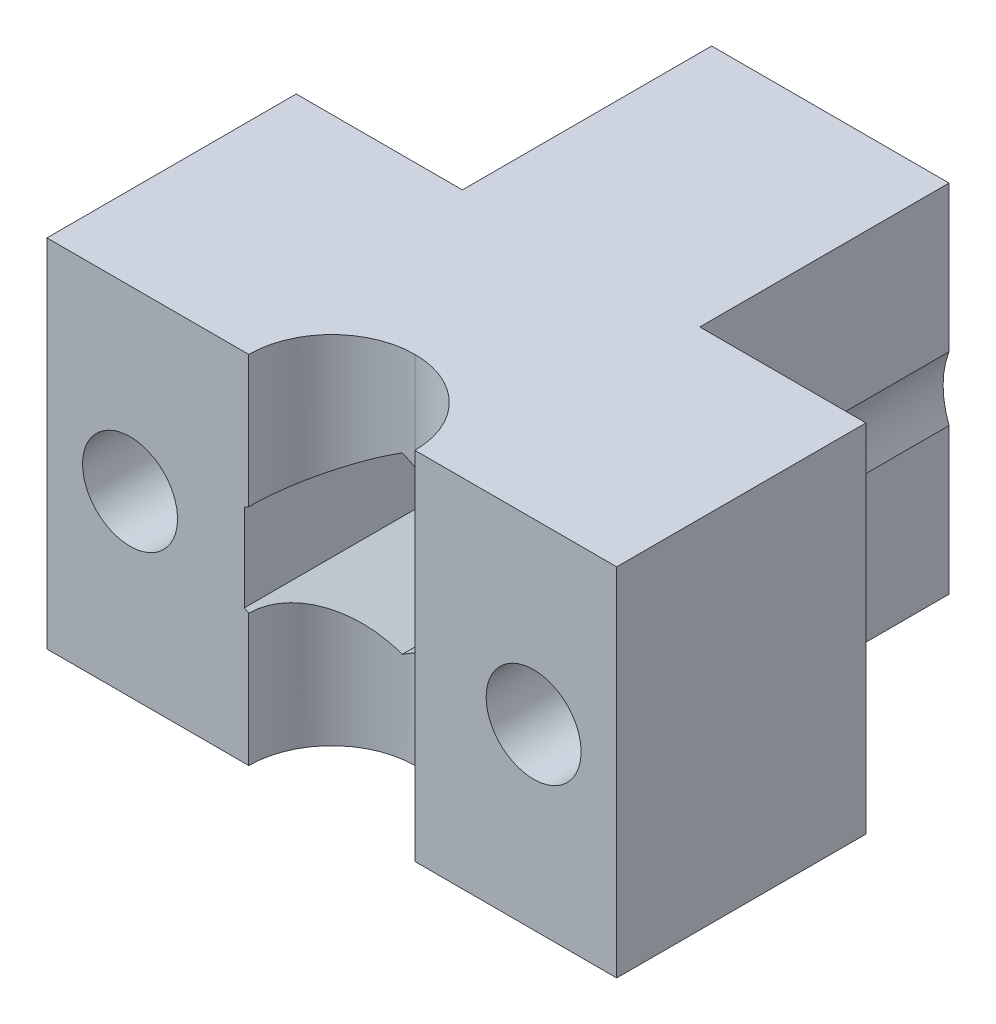
ISO-10303-21;
HEADER;
FILE_DESCRIPTION(('STEP AP214'),'2;1');
FILE_NAME('part.step','',(''),(''),'','','');
FILE_SCHEMA(('AUTOMOTIVE_DESIGN { 1 0 10303 214 1 1 1 1 }'));
ENDSEC;
DATA;
#1=APPLICATION_CONTEXT('core data for automotive mechanical design processes');
#2=APPLICATION_PROTOCOL_DEFINITION('international standard','automotive_design',2000,#1);
#3=PRODUCT_CONTEXT('',#1,'mechanical');
#4=PRODUCT('Part','Part','',(#3));
#5=PRODUCT_RELATED_PRODUCT_CATEGORY('part','',(#4));
#6=PRODUCT_DEFINITION_FORMATION('','',#4);
#7=PRODUCT_DEFINITION_CONTEXT('part definition',#1,'design');
#8=PRODUCT_DEFINITION('design','',#6,#7);
#9=PRODUCT_DEFINITION_SHAPE('','',#8);
#10=(LENGTH_UNIT() NAMED_UNIT(*) SI_UNIT(.MILLI.,.METRE.));
#11=(NAMED_UNIT(*) PLANE_ANGLE_UNIT() SI_UNIT($,.RADIAN.));
#12=(NAMED_UNIT(*) SI_UNIT($,.STERADIAN.) SOLID_ANGLE_UNIT());
#13=UNCERTAINTY_MEASURE_WITH_UNIT(LENGTH_MEASURE(1.E-05),#10,'distance_accuracy_value','');
#14=(GEOMETRIC_REPRESENTATION_CONTEXT(3) GLOBAL_UNCERTAINTY_ASSIGNED_CONTEXT((#13)) GLOBAL_UNIT_ASSIGNED_CONTEXT((#10,
#11,#12)) REPRESENTATION_CONTEXT('',''));
#15=CARTESIAN_POINT('',(0.,0.,0.));
#16=DIRECTION('',(0.,0.,1.));
#17=DIRECTION('',(1.,0.,0.));
#18=AXIS2_PLACEMENT_3D('',#15,#16,#17);
#19=CARTESIAN_POINT('',(0.,0.,10.));
#20=DIRECTION('',(0.,-1.,0.));
#21=DIRECTION('',(1.,0.,0.));
#22=AXIS2_PLACEMENT_3D('',#19,#20,#21);
#23=CYLINDRICAL_SURFACE('',#22,7.);
#24=CARTESIAN_POINT('',(0.,8.22735026918962,10.));
#25=DIRECTION('',(0.5,-0.866025403784439,0.));
#26=DIRECTION('',(-0.866025403784439,-0.5,0.));
#27=AXIS2_PLACEMENT_3D('',#24,#25,#26);
#28=ELLIPSE('',#27,8.08290376865476,7.);
#29=CARTESIAN_POINT('',(0.,8.22735026918962,3.));
#30=VERTEX_POINT('',#29);
#31=CARTESIAN_POINT('',(-1.,7.65,3.07179676972449));
#32=VERTEX_POINT('',#31);
#33=EDGE_CURVE('E456',#30,#32,#28,.F.);
#34=ORIENTED_EDGE('',*,*,#33,.T.);
#35=CARTESIAN_POINT('',(0.,7.07264973081037,10.));
#36=DIRECTION('',(-0.5,-0.866025403784439,0.));
#37=DIRECTION('',(0.866025403784439,-0.5,0.));
#38=AXIS2_PLACEMENT_3D('',#35,#36,#37);
#39=ELLIPSE('',#38,8.08290376865476,7.);
#40=CARTESIAN_POINT('',(-7.,11.1141016151378,10.));
#41=VERTEX_POINT('',#40);
#42=EDGE_CURVE('E459',#32,#41,#39,.F.);
#43=ORIENTED_EDGE('',*,*,#42,.T.);
#44=DIRECTION('',(0.,-1.,0.));
#45=VECTOR('',#44,1.);
#46=CARTESIAN_POINT('',(-7.00000000000001,30.,10.));
#47=LINE('',#46,#45);
#48=CARTESIAN_POINT('',(-7.,0.,10.));
#49=VERTEX_POINT('',#48);
#50=EDGE_CURVE('E394',#41,#49,#47,.T.);
#51=ORIENTED_EDGE('',*,*,#50,.T.);
#52=CARTESIAN_POINT('',(0.,0.,10.));
#53=DIRECTION('',(0.,-1.,0.));
#54=DIRECTION('',(0.,0.,-1.));
#55=AXIS2_PLACEMENT_3D('',#52,#53,#54);
#56=CIRCLE('',#55,7.);
#57=CARTESIAN_POINT('',(0.,0.,3.));
#58=VERTEX_POINT('',#57);
#59=EDGE_CURVE('E426',#58,#49,#56,.F.);
#60=ORIENTED_EDGE('',*,*,#59,.F.);
#61=DIRECTION('',(0.,1.,0.));
#62=VECTOR('',#61,1.);
#63=CARTESIAN_POINT('',(0.,0.,3.));
#64=LINE('',#63,#62);
#65=EDGE_CURVE('E320',#58,#30,#64,.T.);
#66=ORIENTED_EDGE('',*,*,#65,.T.);
#67=EDGE_LOOP('',(#34,#43,#51,#60,#66));
#68=FACE_BOUND('',#67,.T.);
#69=ADVANCED_FACE('F37',(#68),#23,.F.);
#70=CARTESIAN_POINT('',(-10.,0.,0.));
#71=DIRECTION('',(1.,0.,0.));
#72=DIRECTION('',(0.,0.,-1.));
#73=AXIS2_PLACEMENT_3D('',#70,#71,#72);
#74=PLANE('',#73);
#75=DIRECTION('',(0.,0.,1.));
#76=VECTOR('',#75,1.);
#77=CARTESIAN_POINT('',(-10.,17.6925824035673,-32.));
#78=LINE('',#77,#76);
#79=CARTESIAN_POINT('',(-10.,17.6925824035673,-11.));
#80=VERTEX_POINT('',#79);
#81=CARTESIAN_POINT('',(-10.,17.6925824035673,-16.3));
#82=VERTEX_POINT('',#81);
#83=EDGE_CURVE('E450',#80,#82,#78,.F.);
#84=ORIENTED_EDGE('',*,*,#83,.F.);
#85=DIRECTION('',(0.,1.,0.));
#86=VECTOR('',#85,1.);
#87=CARTESIAN_POINT('',(-10.,0.,-11.));
#88=LINE('',#87,#86);
#89=CARTESIAN_POINT('',(-10.,30.,-11.));
#90=VERTEX_POINT('',#89);
#91=EDGE_CURVE('E354',#80,#90,#88,.T.);
#92=ORIENTED_EDGE('',*,*,#91,.T.);
#93=DIRECTION('',(0.,0.,-1.));
#94=VECTOR('',#93,1.);
#95=CARTESIAN_POINT('',(-10.,30.,-11.));
#96=LINE('',#95,#94);
#97=CARTESIAN_POINT('',(-10.,30.,-32.));
#98=VERTEX_POINT('',#97);
#99=EDGE_CURVE('E358',#90,#98,#96,.T.);
#100=ORIENTED_EDGE('',*,*,#99,.T.);
#101=DIRECTION('',(0.,-1.,0.));
#102=VECTOR('',#101,1.);
#103=CARTESIAN_POINT('',(-10.,0.,-32.));
#104=LINE('',#103,#102);
#105=CARTESIAN_POINT('',(-10.,17.6925824035673,-32.));
#106=VERTEX_POINT('',#105);
#107=EDGE_CURVE('E361',#98,#106,#104,.T.);
#108=ORIENTED_EDGE('',*,*,#107,.T.);
#109=CARTESIAN_POINT('',(-10.,17.6925824035673,-26.7));
#110=VERTEX_POINT('',#109);
#111=EDGE_CURVE('E448',#110,#106,#78,.F.);
#112=ORIENTED_EDGE('',*,*,#111,.F.);
#113=DIRECTION('',(0.,-1.,0.));
#114=VECTOR('',#113,1.);
#115=CARTESIAN_POINT('',(-10.,4.8,-26.7));
#116=LINE('',#115,#114);
#117=CARTESIAN_POINT('',(-10.,25.2,-26.7));
#118=VERTEX_POINT('',#117);
#119=EDGE_CURVE('E337',#118,#110,#116,.T.);
#120=ORIENTED_EDGE('',*,*,#119,.F.);
#121=DIRECTION('',(0.,0.,-1.));
#122=VECTOR('',#121,1.);
#123=CARTESIAN_POINT('',(-10.,25.2,-16.3));
#124=LINE('',#123,#122);
#125=CARTESIAN_POINT('',(-10.,25.2,-16.3));
#126=VERTEX_POINT('',#125);
#127=EDGE_CURVE('E333',#126,#118,#124,.T.);
#128=ORIENTED_EDGE('',*,*,#127,.F.);
#129=DIRECTION('',(0.,1.,0.));
#130=VECTOR('',#129,1.);
#131=CARTESIAN_POINT('',(-10.,4.80000000000001,-16.3));
#132=LINE('',#131,#130);
#133=EDGE_CURVE('E329',#82,#126,#132,.T.);
#134=ORIENTED_EDGE('',*,*,#133,.F.);
#135=EDGE_LOOP('',(#84,#92,#100,#108,#112,#120,#128,#134));
#136=FACE_BOUND('',#135,.T.);
#137=ADVANCED_FACE('F521',(#136),#74,.F.);
#138=DIRECTION('',(0.,0.,1.));
#139=VECTOR('',#138,1.);
#140=CARTESIAN_POINT('',(-10.,12.3074175964327,-32.));
#141=LINE('',#140,#139);
#142=CARTESIAN_POINT('',(-10.,12.3074175964327,-32.));
#143=VERTEX_POINT('',#142);
#144=CARTESIAN_POINT('',(-10.,12.3074175964327,-26.7));
#145=VERTEX_POINT('',#144);
#146=EDGE_CURVE('E447',#143,#145,#141,.T.);
#147=ORIENTED_EDGE('',*,*,#146,.F.);
#148=CARTESIAN_POINT('',(-10.,0.,-32.));
#149=VERTEX_POINT('',#148);
#150=EDGE_CURVE('E360',#143,#149,#104,.T.);
#151=ORIENTED_EDGE('',*,*,#150,.T.);
#152=DIRECTION('',(0.,0.,1.));
#153=VECTOR('',#152,1.);
#154=CARTESIAN_POINT('',(-10.,0.,-11.));
#155=LINE('',#154,#153);
#156=CARTESIAN_POINT('',(-10.,0.,-11.));
#157=VERTEX_POINT('',#156);
#158=EDGE_CURVE('E351',#149,#157,#155,.T.);
#159=ORIENTED_EDGE('',*,*,#158,.T.);
#160=CARTESIAN_POINT('',(-10.,12.3074175964327,-11.));
#161=VERTEX_POINT('',#160);
#162=EDGE_CURVE('E355',#157,#161,#88,.T.);
#163=ORIENTED_EDGE('',*,*,#162,.T.);
#164=CARTESIAN_POINT('',(-10.,12.3074175964327,-16.3));
#165=VERTEX_POINT('',#164);
#166=EDGE_CURVE('E444',#165,#161,#141,.T.);
#167=ORIENTED_EDGE('',*,*,#166,.F.);
#168=CARTESIAN_POINT('',(-10.,4.80000000000001,-16.3));
#169=VERTEX_POINT('',#168);
#170=EDGE_CURVE('E330',#169,#165,#132,.T.);
#171=ORIENTED_EDGE('',*,*,#170,.F.);
#172=DIRECTION('',(0.,0.,1.));
#173=VECTOR('',#172,1.);
#174=CARTESIAN_POINT('',(-10.,4.80000000000001,-16.3));
#175=LINE('',#174,#173);
#176=CARTESIAN_POINT('',(-10.,4.8,-26.7));
#177=VERTEX_POINT('',#176);
#178=EDGE_CURVE('E324',#177,#169,#175,.T.);
#179=ORIENTED_EDGE('',*,*,#178,.F.);
#180=EDGE_CURVE('E336',#145,#177,#116,.T.);
#181=ORIENTED_EDGE('',*,*,#180,.F.);
#182=EDGE_LOOP('',(#147,#151,#159,#163,#167,#171,#179,#181));
#183=FACE_BOUND('',#182,.T.);
#184=ADVANCED_FACE('F525',(#183),#74,.F.);
#185=CARTESIAN_POINT('',(10.,0.,0.));
#186=DIRECTION('',(1.,0.,0.));
#187=DIRECTION('',(0.,0.,-1.));
#188=AXIS2_PLACEMENT_3D('',#185,#186,#187);
#189=PLANE('',#188);
#190=DIRECTION('',(0.,-1.,0.));
#191=VECTOR('',#190,1.);
#192=CARTESIAN_POINT('',(10.,0.,-11.));
#193=LINE('',#192,#191);
#194=CARTESIAN_POINT('',(10.,30.,-11.));
#195=VERTEX_POINT('',#194);
#196=CARTESIAN_POINT('',(10.,17.6925824035672,-11.));
#197=VERTEX_POINT('',#196);
#198=EDGE_CURVE('E381',#195,#197,#193,.T.);
#199=ORIENTED_EDGE('',*,*,#198,.T.);
#200=DIRECTION('',(0.,0.,1.));
#201=VECTOR('',#200,1.);
#202=CARTESIAN_POINT('',(10.,17.6925824035672,-32.));
#203=LINE('',#202,#201);
#204=CARTESIAN_POINT('',(10.,17.6925824035672,-32.));
#205=VERTEX_POINT('',#204);
#206=EDGE_CURVE('E441',#197,#205,#203,.F.);
#207=ORIENTED_EDGE('',*,*,#206,.T.);
#208=DIRECTION('',(0.,1.,0.));
#209=VECTOR('',#208,1.);
#210=CARTESIAN_POINT('',(10.,0.,-32.));
#211=LINE('',#210,#209);
#212=CARTESIAN_POINT('',(10.,30.,-32.));
#213=VERTEX_POINT('',#212);
#214=EDGE_CURVE('E374',#205,#213,#211,.T.);
#215=ORIENTED_EDGE('',*,*,#214,.T.);
#216=DIRECTION('',(0.,0.,1.));
#217=VECTOR('',#216,1.);
#218=CARTESIAN_POINT('',(10.,30.,-11.));
#219=LINE('',#218,#217);
#220=EDGE_CURVE('E378',#213,#195,#219,.T.);
#221=ORIENTED_EDGE('',*,*,#220,.T.);
#222=EDGE_LOOP('',(#199,#207,#215,#221));
#223=FACE_BOUND('',#222,.T.);
#224=ADVANCED_FACE('F577',(#223),#189,.T.);
#225=CARTESIAN_POINT('',(10.,0.,-32.));
#226=VERTEX_POINT('',#225);
#227=CARTESIAN_POINT('',(10.,12.3074175964328,-32.));
#228=VERTEX_POINT('',#227);
#229=EDGE_CURVE('E375',#226,#228,#211,.T.);
#230=ORIENTED_EDGE('',*,*,#229,.T.);
#231=DIRECTION('',(0.,0.,1.));
#232=VECTOR('',#231,1.);
#233=CARTESIAN_POINT('',(10.,12.3074175964328,-32.));
#234=LINE('',#233,#232);
#235=CARTESIAN_POINT('',(10.,12.3074175964328,-11.));
#236=VERTEX_POINT('',#235);
#237=EDGE_CURVE('E436',#228,#236,#234,.T.);
#238=ORIENTED_EDGE('',*,*,#237,.T.);
#239=CARTESIAN_POINT('',(10.,0.,-11.));
#240=VERTEX_POINT('',#239);
#241=EDGE_CURVE('E380',#236,#240,#193,.T.);
#242=ORIENTED_EDGE('',*,*,#241,.T.);
#243=DIRECTION('',(0.,0.,-1.));
#244=VECTOR('',#243,1.);
#245=CARTESIAN_POINT('',(10.,0.,-11.));
#246=LINE('',#245,#244);
#247=EDGE_CURVE('E371',#240,#226,#246,.T.);
#248=ORIENTED_EDGE('',*,*,#247,.T.);
#249=EDGE_LOOP('',(#230,#238,#242,#248));
#250=FACE_BOUND('',#249,.T.);
#251=ADVANCED_FACE('F570',(#250),#189,.T.);
#252=CARTESIAN_POINT('',(24.,4.80000000000001,-16.3));
#253=DIRECTION('',(0.,-1.,0.));
#254=DIRECTION('',(0.,0.,-1.));
#255=AXIS2_PLACEMENT_3D('',#252,#253,#254);
#256=PLANE('',#255);
#257=DIRECTION('',(0.,0.,-1.));
#258=VECTOR('',#257,1.);
#259=CARTESIAN_POINT('',(6.,4.8,-26.7));
#260=LINE('',#259,#258);
#261=CARTESIAN_POINT('',(6.,4.80000000000001,-16.3));
#262=VERTEX_POINT('',#261);
#263=CARTESIAN_POINT('',(6.,4.8,-26.7));
#264=VERTEX_POINT('',#263);
#265=EDGE_CURVE('E305',#262,#264,#260,.T.);
#266=ORIENTED_EDGE('',*,*,#265,.T.);
#267=DIRECTION('',(-1.,0.,0.));
#268=VECTOR('',#267,1.);
#269=CARTESIAN_POINT('',(24.,4.8,-26.7));
#270=LINE('',#269,#268);
#271=EDGE_CURVE('E341',#264,#177,#270,.T.);
#272=ORIENTED_EDGE('',*,*,#271,.T.);
#273=ORIENTED_EDGE('',*,*,#178,.T.);
#274=DIRECTION('',(-1.,0.,0.));
#275=VECTOR('',#274,1.);
#276=CARTESIAN_POINT('',(24.,4.80000000000001,-16.3));
#277=LINE('',#276,#275);
#278=EDGE_CURVE('E340',#262,#169,#277,.T.);
#279=ORIENTED_EDGE('',*,*,#278,.F.);
#280=EDGE_LOOP('',(#266,#272,#273,#279));
#281=FACE_BOUND('',#280,.T.);
#282=ADVANCED_FACE('F559',(#281),#256,.F.);
#283=CARTESIAN_POINT('',(24.,4.8,-26.7));
#284=DIRECTION('',(0.,0.,-1.));
#285=DIRECTION('',(-1.,0.,0.));
#286=AXIS2_PLACEMENT_3D('',#283,#284,#285);
#287=PLANE('',#286);
#288=CARTESIAN_POINT('',(-1.,15.,-26.7));
#289=DIRECTION('',(0.,0.,-1.));
#290=DIRECTION('',(-1.,0.,0.));
#291=AXIS2_PLACEMENT_3D('',#288,#289,#290);
#292=CIRCLE('',#291,4.);
#293=CARTESIAN_POINT('',(-5.,15.,-26.7));
#294=VERTEX_POINT('',#293);
#295=EDGE_CURVE('E289',#294,#294,#292,.T.);
#296=ORIENTED_EDGE('',*,*,#295,.T.);
#297=EDGE_LOOP('',(#296));
#298=FACE_BOUND('',#297,.T.);
#299=CARTESIAN_POINT('',(-17.,15.,-26.7));
#300=DIRECTION('',(0.,0.,-1.));
#301=DIRECTION('',(-1.,0.,0.));
#302=AXIS2_PLACEMENT_3D('',#299,#300,#301);
#303=CIRCLE('',#302,7.5);
#304=EDGE_CURVE('E297',#145,#110,#303,.F.);
#305=ORIENTED_EDGE('',*,*,#304,.F.);
#306=ORIENTED_EDGE('',*,*,#180,.T.);
#307=ORIENTED_EDGE('',*,*,#271,.F.);
#308=DIRECTION('',(0.,1.,0.));
#309=VECTOR('',#308,1.);
#310=CARTESIAN_POINT('',(6.,4.8,-26.7));
#311=LINE('',#310,#309);
#312=CARTESIAN_POINT('',(6.,25.2,-26.7));
#313=VERTEX_POINT('',#312);
#314=EDGE_CURVE('E307',#264,#313,#311,.T.);
#315=ORIENTED_EDGE('',*,*,#314,.T.);
#316=DIRECTION('',(-1.,0.,0.));
#317=VECTOR('',#316,1.);
#318=CARTESIAN_POINT('',(24.,25.2,-26.7));
#319=LINE('',#318,#317);
#320=EDGE_CURVE('E345',#313,#118,#319,.T.);
#321=ORIENTED_EDGE('',*,*,#320,.T.);
#322=ORIENTED_EDGE('',*,*,#119,.T.);
#323=EDGE_LOOP('',(#305,#306,#307,#315,#321,#322));
#324=FACE_BOUND('',#323,.T.);
#325=ADVANCED_FACE('F555',(#298,#324),#287,.F.);
#326=CARTESIAN_POINT('',(24.,25.2,-16.3));
#327=DIRECTION('',(0.,1.,0.));
#328=DIRECTION('',(0.,0.,1.));
#329=AXIS2_PLACEMENT_3D('',#326,#327,#328);
#330=PLANE('',#329);
#331=DIRECTION('',(0.,0.,1.));
#332=VECTOR('',#331,1.);
#333=CARTESIAN_POINT('',(6.,25.2,-26.7));
#334=LINE('',#333,#332);
#335=CARTESIAN_POINT('',(6.,25.2,-16.3));
#336=VERTEX_POINT('',#335);
#337=EDGE_CURVE('E309',#313,#336,#334,.T.);
#338=ORIENTED_EDGE('',*,*,#337,.T.);
#339=DIRECTION('',(-1.,0.,0.));
#340=VECTOR('',#339,1.);
#341=CARTESIAN_POINT('',(24.,25.2,-16.3));
#342=LINE('',#341,#340);
#343=EDGE_CURVE('E347',#336,#126,#342,.T.);
#344=ORIENTED_EDGE('',*,*,#343,.T.);
#345=ORIENTED_EDGE('',*,*,#127,.T.);
#346=ORIENTED_EDGE('',*,*,#320,.F.);
#347=EDGE_LOOP('',(#338,#344,#345,#346));
#348=FACE_BOUND('',#347,.T.);
#349=ADVANCED_FACE('F558',(#348),#330,.F.);
#350=CARTESIAN_POINT('',(24.,4.80000000000001,-16.3));
#351=DIRECTION('',(0.,0.,1.));
#352=DIRECTION('',(1.,0.,0.));
#353=AXIS2_PLACEMENT_3D('',#350,#351,#352);
#354=PLANE('',#353);
#355=CARTESIAN_POINT('',(-1.,15.,-16.3));
#356=DIRECTION('',(0.,0.,1.));
#357=DIRECTION('',(1.,0.,0.));
#358=AXIS2_PLACEMENT_3D('',#355,#356,#357);
#359=CIRCLE('',#358,4.);
#360=CARTESIAN_POINT('',(3.,15.,-16.3));
#361=VERTEX_POINT('',#360);
#362=EDGE_CURVE('E286',#361,#361,#359,.T.);
#363=ORIENTED_EDGE('',*,*,#362,.T.);
#364=EDGE_LOOP('',(#363));
#365=FACE_BOUND('',#364,.T.);
#366=CARTESIAN_POINT('',(-17.,15.,-16.3));
#367=DIRECTION('',(0.,0.,1.));
#368=DIRECTION('',(1.,0.,0.));
#369=AXIS2_PLACEMENT_3D('',#366,#367,#368);
#370=CIRCLE('',#369,7.5);
#371=EDGE_CURVE('E294',#82,#165,#370,.F.);
#372=ORIENTED_EDGE('',*,*,#371,.F.);
#373=ORIENTED_EDGE('',*,*,#133,.T.);
#374=ORIENTED_EDGE('',*,*,#343,.F.);
#375=DIRECTION('',(0.,-1.,0.));
#376=VECTOR('',#375,1.);
#377=CARTESIAN_POINT('',(6.,4.8,-16.3));
#378=LINE('',#377,#376);
#379=EDGE_CURVE('E302',#336,#262,#378,.T.);
#380=ORIENTED_EDGE('',*,*,#379,.T.);
#381=ORIENTED_EDGE('',*,*,#278,.T.);
#382=ORIENTED_EDGE('',*,*,#170,.T.);
#383=EDGE_LOOP('',(#372,#373,#374,#380,#381,#382));
#384=FACE_BOUND('',#383,.T.);
#385=ADVANCED_FACE('F563',(#365,#384),#354,.F.);
#386=CARTESIAN_POINT('',(-24.,0.,-32.));
#387=DIRECTION('',(0.,0.,1.));
#388=DIRECTION('',(1.,0.,0.));
#389=AXIS2_PLACEMENT_3D('',#386,#387,#388);
#390=PLANE('',#389);
#391=CARTESIAN_POINT('',(-1.,15.,-32.));
#392=DIRECTION('',(0.,0.,-1.));
#393=DIRECTION('',(-1.,0.,0.));
#394=AXIS2_PLACEMENT_3D('',#391,#392,#393);
#395=CIRCLE('',#394,4.);
#396=CARTESIAN_POINT('',(-5.,15.,-32.));
#397=VERTEX_POINT('',#396);
#398=EDGE_CURVE('E283',#397,#397,#395,.T.);
#399=ORIENTED_EDGE('',*,*,#398,.F.);
#400=EDGE_LOOP('',(#399));
#401=FACE_BOUND('',#400,.T.);
#402=CARTESIAN_POINT('',(-17.,15.,-32.));
#403=DIRECTION('',(0.,0.,-1.));
#404=DIRECTION('',(-1.,0.,0.));
#405=AXIS2_PLACEMENT_3D('',#402,#403,#404);
#406=CIRCLE('',#405,7.5);
#407=EDGE_CURVE('E60',#106,#143,#406,.T.);
#408=ORIENTED_EDGE('',*,*,#407,.F.);
#409=ORIENTED_EDGE('',*,*,#107,.F.);
#410=DIRECTION('',(1.,0.,0.));
#411=VECTOR('',#410,1.);
#412=CARTESIAN_POINT('',(-24.,30.,-32.));
#413=LINE('',#412,#411);
#414=EDGE_CURVE('E391',#98,#213,#413,.T.);
#415=ORIENTED_EDGE('',*,*,#414,.T.);
#416=ORIENTED_EDGE('',*,*,#214,.F.);
#417=CARTESIAN_POINT('',(17.,15.,-32.));
#418=DIRECTION('',(0.,0.,-1.));
#419=DIRECTION('',(-1.,0.,0.));
#420=AXIS2_PLACEMENT_3D('',#417,#418,#419);
#421=CIRCLE('',#420,7.5);
#422=EDGE_CURVE('E300',#228,#205,#421,.T.);
#423=ORIENTED_EDGE('',*,*,#422,.F.);
#424=ORIENTED_EDGE('',*,*,#229,.F.);
#425=DIRECTION('',(1.,0.,0.));
#426=VECTOR('',#425,1.);
#427=CARTESIAN_POINT('',(-24.,0.,-32.));
#428=LINE('',#427,#426);
#429=EDGE_CURVE('E389',#149,#226,#428,.T.);
#430=ORIENTED_EDGE('',*,*,#429,.F.);
#431=ORIENTED_EDGE('',*,*,#150,.F.);
#432=EDGE_LOOP('',(#408,#409,#415,#416,#423,#424,#430,#431));
#433=FACE_BOUND('',#432,.T.);
#434=ADVANCED_FACE('F567',(#401,#433),#390,.F.);
#435=CARTESIAN_POINT('',(-24.,30.,10.));
#436=DIRECTION('',(0.,0.,-1.));
#437=DIRECTION('',(-1.,0.,0.));
#438=AXIS2_PLACEMENT_3D('',#435,#436,#437);
#439=PLANE('',#438);
#440=CARTESIAN_POINT('',(17.,15.,10.));
#441=DIRECTION('',(0.,0.,-1.));
#442=DIRECTION('',(-1.,0.,0.));
#443=AXIS2_PLACEMENT_3D('',#440,#441,#442);
#444=CIRCLE('',#443,4.);
#445=CARTESIAN_POINT('',(13.,15.,10.));
#446=VERTEX_POINT('',#445);
#447=EDGE_CURVE('E313',#446,#446,#444,.T.);
#448=ORIENTED_EDGE('',*,*,#447,.T.);
#449=EDGE_LOOP('',(#448));
#450=FACE_BOUND('',#449,.T.);
#451=DIRECTION('',(1.,0.,0.));
#452=VECTOR('',#451,1.);
#453=CARTESIAN_POINT('',(-24.,30.,10.));
#454=LINE('',#453,#452);
#455=CARTESIAN_POINT('',(7.,30.,10.));
#456=VERTEX_POINT('',#455);
#457=CARTESIAN_POINT('',(24.,30.,10.));
#458=VERTEX_POINT('',#457);
#459=EDGE_CURVE('E409',#456,#458,#454,.T.);
#460=ORIENTED_EDGE('',*,*,#459,.F.);
#461=DIRECTION('',(0.,1.,0.));
#462=VECTOR('',#461,1.);
#463=CARTESIAN_POINT('',(7.,0.,10.));
#464=LINE('',#463,#462);
#465=CARTESIAN_POINT('',(7.,0.,10.));
#466=VERTEX_POINT('',#465);
#467=EDGE_CURVE('E399',#466,#456,#464,.T.);
#468=ORIENTED_EDGE('',*,*,#467,.F.);
#469=DIRECTION('',(1.,0.,0.));
#470=VECTOR('',#469,1.);
#471=CARTESIAN_POINT('',(-24.,0.,10.));
#472=LINE('',#471,#470);
#473=CARTESIAN_POINT('',(24.,0.,10.));
#474=VERTEX_POINT('',#473);
#475=EDGE_CURVE('E418',#466,#474,#472,.T.);
#476=ORIENTED_EDGE('',*,*,#475,.T.);
#477=DIRECTION('',(0.,-1.,0.));
#478=VECTOR('',#477,1.);
#479=CARTESIAN_POINT('',(24.,30.,10.));
#480=LINE('',#479,#478);
#481=EDGE_CURVE('E413',#458,#474,#480,.T.);
#482=ORIENTED_EDGE('',*,*,#481,.F.);
#483=EDGE_LOOP('',(#460,#468,#476,#482));
#484=FACE_BOUND('',#483,.T.);
#485=ADVANCED_FACE('F489',(#450,#484),#439,.F.);
#486=CARTESIAN_POINT('',(24.,30.,10.));
#487=DIRECTION('',(-1.,0.,0.));
#488=DIRECTION('',(0.,0.,1.));
#489=AXIS2_PLACEMENT_3D('',#486,#487,#488);
#490=PLANE('',#489);
#491=DIRECTION('',(0.,0.,-1.));
#492=VECTOR('',#491,1.);
#493=CARTESIAN_POINT('',(24.,0.,10.));
#494=LINE('',#493,#492);
#495=CARTESIAN_POINT('',(24.,0.,-11.));
#496=VERTEX_POINT('',#495);
#497=EDGE_CURVE('E402',#474,#496,#494,.T.);
#498=ORIENTED_EDGE('',*,*,#497,.T.);
#499=DIRECTION('',(0.,-1.,0.));
#500=VECTOR('',#499,1.);
#501=CARTESIAN_POINT('',(24.,0.,-11.));
#502=LINE('',#501,#500);
#503=CARTESIAN_POINT('',(24.,30.,-11.));
#504=VERTEX_POINT('',#503);
#505=EDGE_CURVE('E369',#504,#496,#502,.T.);
#506=ORIENTED_EDGE('',*,*,#505,.F.);
#507=DIRECTION('',(0.,0.,-1.));
#508=VECTOR('',#507,1.);
#509=CARTESIAN_POINT('',(24.,30.,10.));
#510=LINE('',#509,#508);
#511=EDGE_CURVE('E403',#458,#504,#510,.T.);
#512=ORIENTED_EDGE('',*,*,#511,.F.);
#513=ORIENTED_EDGE('',*,*,#481,.T.);
#514=EDGE_LOOP('',(#498,#506,#512,#513));
#515=FACE_BOUND('',#514,.T.);
#516=ADVANCED_FACE('F492',(#515),#490,.F.);
#517=CARTESIAN_POINT('',(-24.,30.,10.));
#518=DIRECTION('',(1.,0.,0.));
#519=DIRECTION('',(0.,0.,-1.));
#520=AXIS2_PLACEMENT_3D('',#517,#518,#519);
#521=PLANE('',#520);
#522=DIRECTION('',(0.,0.,1.));
#523=VECTOR('',#522,1.);
#524=CARTESIAN_POINT('',(-24.,30.,10.));
#525=LINE('',#524,#523);
#526=CARTESIAN_POINT('',(-24.,30.,-11.));
#527=VERTEX_POINT('',#526);
#528=CARTESIAN_POINT('',(-24.,30.,10.));
#529=VERTEX_POINT('',#528);
#530=EDGE_CURVE('E406',#527,#529,#525,.T.);
#531=ORIENTED_EDGE('',*,*,#530,.F.);
#532=DIRECTION('',(0.,1.,0.));
#533=VECTOR('',#532,1.);
#534=CARTESIAN_POINT('',(-24.,0.,-11.));
#535=LINE('',#534,#533);
#536=CARTESIAN_POINT('',(-24.,0.,-11.));
#537=VERTEX_POINT('',#536);
#538=EDGE_CURVE('E344',#537,#527,#535,.T.);
#539=ORIENTED_EDGE('',*,*,#538,.F.);
#540=DIRECTION('',(0.,0.,1.));
#541=VECTOR('',#540,1.);
#542=CARTESIAN_POINT('',(-24.,0.,10.));
#543=LINE('',#542,#541);
#544=CARTESIAN_POINT('',(-24.,0.,10.));
#545=VERTEX_POINT('',#544);
#546=EDGE_CURVE('E416',#537,#545,#543,.T.);
#547=ORIENTED_EDGE('',*,*,#546,.T.);
#548=DIRECTION('',(0.,-1.,0.));
#549=VECTOR('',#548,1.);
#550=CARTESIAN_POINT('',(-24.,30.,10.));
#551=LINE('',#550,#549);
#552=EDGE_CURVE('E423',#529,#545,#551,.T.);
#553=ORIENTED_EDGE('',*,*,#552,.F.);
#554=EDGE_LOOP('',(#531,#539,#547,#553));
#555=FACE_BOUND('',#554,.T.);
#556=ADVANCED_FACE('F593',(#555),#521,.F.);
#557=CARTESIAN_POINT('',(-17.,15.,10.));
#558=DIRECTION('',(0.,0.,-1.));
#559=DIRECTION('',(-1.,0.,0.));
#560=AXIS2_PLACEMENT_3D('',#557,#558,#559);
#561=CIRCLE('',#560,4.);
#562=CARTESIAN_POINT('',(-21.,15.,10.));
#563=VERTEX_POINT('',#562);
#564=EDGE_CURVE('E321',#563,#563,#561,.T.);
#565=ORIENTED_EDGE('',*,*,#564,.T.);
#566=EDGE_LOOP('',(#565));
#567=FACE_BOUND('',#566,.T.);
#568=DIRECTION('',(0.,1.,0.));
#569=VECTOR('',#568,1.);
#570=CARTESIAN_POINT('',(-7.36528671781563,30.,10.));
#571=LINE('',#570,#569);
#572=CARTESIAN_POINT('',(-7.36528671781562,11.325,10.));
#573=VERTEX_POINT('',#572);
#574=CARTESIAN_POINT('',(-7.36528671781563,18.675,10.));
#575=VERTEX_POINT('',#574);
#576=EDGE_CURVE('E11',#573,#575,#571,.T.);
#577=ORIENTED_EDGE('',*,*,#576,.T.);
#578=DIRECTION('',(0.866025403784439,0.5,0.));
#579=VECTOR('',#578,1.);
#580=CARTESIAN_POINT('',(-14.9374528305245,14.303207856479,10.));
#581=LINE('',#580,#579);
#582=CARTESIAN_POINT('',(-7.,18.8858983848622,10.));
#583=VERTEX_POINT('',#582);
#584=EDGE_CURVE('E280',#575,#583,#581,.T.);
#585=ORIENTED_EDGE('',*,*,#584,.T.);
#586=CARTESIAN_POINT('',(-7.00000000000001,30.,10.));
#587=VERTEX_POINT('',#586);
#588=EDGE_CURVE('E396',#587,#583,#47,.T.);
#589=ORIENTED_EDGE('',*,*,#588,.F.);
#590=EDGE_CURVE('E410',#529,#587,#454,.T.);
#591=ORIENTED_EDGE('',*,*,#590,.F.);
#592=ORIENTED_EDGE('',*,*,#552,.T.);
#593=EDGE_CURVE('E407',#545,#49,#472,.T.);
#594=ORIENTED_EDGE('',*,*,#593,.T.);
#595=ORIENTED_EDGE('',*,*,#50,.F.);
#596=DIRECTION('',(-0.866025403784439,0.5,0.));
#597=VECTOR('',#596,1.);
#598=CARTESIAN_POINT('',(-27.9278338872911,23.196792143521,10.));
#599=LINE('',#598,#597);
#600=EDGE_CURVE('E277',#41,#573,#599,.T.);
#601=ORIENTED_EDGE('',*,*,#600,.T.);
#602=EDGE_LOOP('',(#577,#585,#589,#591,#592,#594,#595,#601));
#603=FACE_BOUND('',#602,.T.);
#604=ADVANCED_FACE('F503',(#567,#603),#439,.F.);
#605=CARTESIAN_POINT('',(0.,30.,0.));
#606=DIRECTION('',(0.,-1.,0.));
#607=DIRECTION('',(0.,0.,-1.));
#608=AXIS2_PLACEMENT_3D('',#605,#606,#607);
#609=PLANE('',#608);
#610=ORIENTED_EDGE('',*,*,#99,.F.);
#611=DIRECTION('',(-1.,0.,0.));
#612=VECTOR('',#611,1.);
#613=CARTESIAN_POINT('',(-10.,30.,-11.));
#614=LINE('',#613,#612);
#615=EDGE_CURVE('E366',#90,#527,#614,.T.);
#616=ORIENTED_EDGE('',*,*,#615,.T.);
#617=ORIENTED_EDGE('',*,*,#530,.T.);
#618=ORIENTED_EDGE('',*,*,#590,.T.);
#619=CARTESIAN_POINT('',(0.,30.,10.));
#620=DIRECTION('',(0.,-1.,0.));
#621=DIRECTION('',(0.,0.,-1.));
#622=AXIS2_PLACEMENT_3D('',#619,#620,#621);
#623=CIRCLE('',#622,7.);
#624=CARTESIAN_POINT('',(0.,30.,3.));
#625=VERTEX_POINT('',#624);
#626=EDGE_CURVE('E429',#587,#625,#623,.T.);
#627=ORIENTED_EDGE('',*,*,#626,.T.);
#628=CARTESIAN_POINT('',(0.,30.,10.));
#629=DIRECTION('',(0.,-1.,0.));
#630=DIRECTION('',(0.,0.,-1.));
#631=AXIS2_PLACEMENT_3D('',#628,#629,#630);
#632=CIRCLE('',#631,7.);
#633=EDGE_CURVE('E432',#625,#456,#632,.T.);
#634=ORIENTED_EDGE('',*,*,#633,.T.);
#635=ORIENTED_EDGE('',*,*,#459,.T.);
#636=ORIENTED_EDGE('',*,*,#511,.T.);
#637=DIRECTION('',(1.,0.,0.));
#638=VECTOR('',#637,1.);
#639=CARTESIAN_POINT('',(10.,30.,-11.));
#640=LINE('',#639,#638);
#641=EDGE_CURVE('E384',#195,#504,#640,.T.);
#642=ORIENTED_EDGE('',*,*,#641,.F.);
#643=ORIENTED_EDGE('',*,*,#220,.F.);
#644=ORIENTED_EDGE('',*,*,#414,.F.);
#645=EDGE_LOOP('',(#610,#616,#617,#618,#627,#634,#635,#636,#642,#643,#644));
#646=FACE_BOUND('',#645,.T.);
#647=ADVANCED_FACE('F497',(#646),#609,.F.);
#648=CARTESIAN_POINT('',(0.,0.,0.));
#649=DIRECTION('',(0.,-1.,0.));
#650=DIRECTION('',(0.,0.,-1.));
#651=AXIS2_PLACEMENT_3D('',#648,#649,#650);
#652=PLANE('',#651);
#653=DIRECTION('',(-1.,0.,0.));
#654=VECTOR('',#653,1.);
#655=CARTESIAN_POINT('',(-10.,0.,-11.));
#656=LINE('',#655,#654);
#657=EDGE_CURVE('E364',#157,#537,#656,.T.);
#658=ORIENTED_EDGE('',*,*,#657,.F.);
#659=ORIENTED_EDGE('',*,*,#158,.F.);
#660=ORIENTED_EDGE('',*,*,#429,.T.);
#661=ORIENTED_EDGE('',*,*,#247,.F.);
#662=DIRECTION('',(1.,0.,0.));
#663=VECTOR('',#662,1.);
#664=CARTESIAN_POINT('',(10.,0.,-11.));
#665=LINE('',#664,#663);
#666=EDGE_CURVE('E386',#240,#496,#665,.T.);
#667=ORIENTED_EDGE('',*,*,#666,.T.);
#668=ORIENTED_EDGE('',*,*,#497,.F.);
#669=ORIENTED_EDGE('',*,*,#475,.F.);
#670=CARTESIAN_POINT('',(0.,0.,10.));
#671=DIRECTION('',(0.,-1.,0.));
#672=DIRECTION('',(0.,0.,-1.));
#673=AXIS2_PLACEMENT_3D('',#670,#671,#672);
#674=CIRCLE('',#673,7.);
#675=EDGE_CURVE('E434',#466,#58,#674,.F.);
#676=ORIENTED_EDGE('',*,*,#675,.T.);
#677=ORIENTED_EDGE('',*,*,#59,.T.);
#678=ORIENTED_EDGE('',*,*,#593,.F.);
#679=ORIENTED_EDGE('',*,*,#546,.F.);
#680=EDGE_LOOP('',(#658,#659,#660,#661,#667,#668,#669,#676,#677,#678,#679));
#681=FACE_BOUND('',#680,.T.);
#682=ADVANCED_FACE('F483',(#681),#652,.T.);
#683=CARTESIAN_POINT('',(10.,0.,-11.));
#684=DIRECTION('',(0.,0.,1.));
#685=DIRECTION('',(0.,-1.,0.));
#686=AXIS2_PLACEMENT_3D('',#683,#684,#685);
#687=PLANE('',#686);
#688=ORIENTED_EDGE('',*,*,#241,.F.);
#689=CARTESIAN_POINT('',(17.,15.,-11.));
#690=DIRECTION('',(0.,0.,-1.));
#691=DIRECTION('',(-1.,0.,0.));
#692=AXIS2_PLACEMENT_3D('',#689,#690,#691);
#693=CIRCLE('',#692,7.5);
#694=EDGE_CURVE('E299',#236,#197,#693,.T.);
#695=ORIENTED_EDGE('',*,*,#694,.T.);
#696=ORIENTED_EDGE('',*,*,#198,.F.);
#697=ORIENTED_EDGE('',*,*,#641,.T.);
#698=ORIENTED_EDGE('',*,*,#505,.T.);
#699=ORIENTED_EDGE('',*,*,#666,.F.);
#700=EDGE_LOOP('',(#688,#695,#696,#697,#698,#699));
#701=FACE_BOUND('',#700,.T.);
#702=CARTESIAN_POINT('',(17.,15.,-11.));
#703=DIRECTION('',(0.,0.,-1.));
#704=DIRECTION('',(-1.,0.,0.));
#705=AXIS2_PLACEMENT_3D('',#702,#703,#704);
#706=CIRCLE('',#705,4.);
#707=CARTESIAN_POINT('',(13.,15.,-11.));
#708=VERTEX_POINT('',#707);
#709=EDGE_CURVE('E317',#708,#708,#706,.T.);
#710=ORIENTED_EDGE('',*,*,#709,.F.);
#711=EDGE_LOOP('',(#710));
#712=FACE_BOUND('',#711,.T.);
#713=ADVANCED_FACE('F575',(#701,#712),#687,.F.);
#714=CARTESIAN_POINT('',(-10.,0.,-11.));
#715=DIRECTION('',(0.,0.,1.));
#716=DIRECTION('',(0.,-1.,0.));
#717=AXIS2_PLACEMENT_3D('',#714,#715,#716);
#718=PLANE('',#717);
#719=ORIENTED_EDGE('',*,*,#538,.T.);
#720=ORIENTED_EDGE('',*,*,#615,.F.);
#721=ORIENTED_EDGE('',*,*,#91,.F.);
#722=CARTESIAN_POINT('',(-17.,15.,-11.));
#723=DIRECTION('',(0.,0.,-1.));
#724=DIRECTION('',(-1.,0.,0.));
#725=AXIS2_PLACEMENT_3D('',#722,#723,#724);
#726=CIRCLE('',#725,7.5);
#727=EDGE_CURVE('E292',#80,#161,#726,.T.);
#728=ORIENTED_EDGE('',*,*,#727,.T.);
#729=ORIENTED_EDGE('',*,*,#162,.F.);
#730=ORIENTED_EDGE('',*,*,#657,.T.);
#731=EDGE_LOOP('',(#719,#720,#721,#728,#729,#730));
#732=FACE_BOUND('',#731,.T.);
#733=CARTESIAN_POINT('',(-17.,15.,-11.));
#734=DIRECTION('',(0.,0.,-1.));
#735=DIRECTION('',(-1.,0.,0.));
#736=AXIS2_PLACEMENT_3D('',#733,#734,#735);
#737=CIRCLE('',#736,4.);
#738=CARTESIAN_POINT('',(-21.,15.,-11.));
#739=VERTEX_POINT('',#738);
#740=EDGE_CURVE('E316',#739,#739,#737,.T.);
#741=ORIENTED_EDGE('',*,*,#740,.F.);
#742=EDGE_LOOP('',(#741));
#743=FACE_BOUND('',#742,.T.);
#744=ADVANCED_FACE('F548',(#732,#743),#718,.F.);
#745=CARTESIAN_POINT('',(-17.,15.,10.));
#746=DIRECTION('',(0.,0.,-1.));
#747=DIRECTION('',(-1.,0.,0.));
#748=AXIS2_PLACEMENT_3D('',#745,#746,#747);
#749=CYLINDRICAL_SURFACE('',#748,4.);
#750=ORIENTED_EDGE('',*,*,#564,.F.);
#751=EDGE_LOOP('',(#750));
#752=FACE_BOUND('',#751,.T.);
#753=ORIENTED_EDGE('',*,*,#740,.T.);
#754=EDGE_LOOP('',(#753));
#755=FACE_BOUND('',#754,.T.);
#756=ADVANCED_FACE('F542',(#752,#755),#749,.F.);
#757=CARTESIAN_POINT('',(17.,15.,10.));
#758=DIRECTION('',(0.,0.,-1.));
#759=DIRECTION('',(-1.,0.,0.));
#760=AXIS2_PLACEMENT_3D('',#757,#758,#759);
#761=CYLINDRICAL_SURFACE('',#760,4.);
#762=ORIENTED_EDGE('',*,*,#447,.F.);
#763=EDGE_LOOP('',(#762));
#764=FACE_BOUND('',#763,.T.);
#765=ORIENTED_EDGE('',*,*,#709,.T.);
#766=EDGE_LOOP('',(#765));
#767=FACE_BOUND('',#766,.T.);
#768=ADVANCED_FACE('F538',(#764,#767),#761,.F.);
#769=CARTESIAN_POINT('',(0.,0.,10.));
#770=DIRECTION('',(0.,1.,0.));
#771=DIRECTION('',(0.,0.,1.));
#772=AXIS2_PLACEMENT_3D('',#769,#770,#771);
#773=CYLINDRICAL_SURFACE('',#772,7.);
#774=DIRECTION('',(0.,1.,0.));
#775=VECTOR('',#774,1.);
#776=CARTESIAN_POINT('',(5.36528671781562,0.,5.50403531646085));
#777=LINE('',#776,#775);
#778=CARTESIAN_POINT('',(5.36528671781562,18.675,5.50403531646086));
#779=VERTEX_POINT('',#778);
#780=CARTESIAN_POINT('',(5.36528671781562,11.325,5.50403531646085));
#781=VERTEX_POINT('',#780);
#782=EDGE_CURVE('E45',#779,#781,#777,.F.);
#783=ORIENTED_EDGE('',*,*,#782,.T.);
#784=CARTESIAN_POINT('',(0.,8.22735026918962,10.));
#785=DIRECTION('',(0.5,-0.866025403784439,0.));
#786=DIRECTION('',(0.866025403784439,0.5,0.));
#787=AXIS2_PLACEMENT_3D('',#784,#785,#786);
#788=ELLIPSE('',#787,8.08290376865476,7.);
#789=EDGE_CURVE('E274',#781,#30,#788,.F.);
#790=ORIENTED_EDGE('',*,*,#789,.T.);
#791=ORIENTED_EDGE('',*,*,#65,.F.);
#792=ORIENTED_EDGE('',*,*,#675,.F.);
#793=ORIENTED_EDGE('',*,*,#467,.T.);
#794=ORIENTED_EDGE('',*,*,#633,.F.);
#795=CARTESIAN_POINT('',(0.,21.7726497308104,3.));
#796=VERTEX_POINT('',#795);
#797=EDGE_CURVE('E312',#796,#625,#64,.T.);
#798=ORIENTED_EDGE('',*,*,#797,.F.);
#799=CARTESIAN_POINT('',(0.,21.7726497308104,10.));
#800=DIRECTION('',(0.5,0.866025403784438,0.));
#801=DIRECTION('',(-0.866025403784439,0.5,0.));
#802=AXIS2_PLACEMENT_3D('',#799,#800,#801);
#803=ELLIPSE('',#802,8.08290376865476,7.);
#804=EDGE_CURVE('E52',#796,#779,#803,.F.);
#805=ORIENTED_EDGE('',*,*,#804,.T.);
#806=EDGE_LOOP('',(#783,#790,#791,#792,#793,#794,#798,#805));
#807=FACE_BOUND('',#806,.T.);
#808=ADVANCED_FACE('F39',(#807),#773,.F.);
#809=ORIENTED_EDGE('',*,*,#588,.T.);
#810=CARTESIAN_POINT('',(0.,22.9273502691896,10.));
#811=DIRECTION('',(-0.5,0.866025403784438,0.));
#812=DIRECTION('',(-0.866025403784439,-0.5,0.));
#813=AXIS2_PLACEMENT_3D('',#810,#811,#812);
#814=ELLIPSE('',#813,8.08290376865476,7.);
#815=CARTESIAN_POINT('',(-1.,22.35,3.07179676972449));
#816=VERTEX_POINT('',#815);
#817=EDGE_CURVE('E454',#583,#816,#814,.F.);
#818=ORIENTED_EDGE('',*,*,#817,.T.);
#819=CARTESIAN_POINT('',(0.,21.7726497308104,10.));
#820=DIRECTION('',(0.5,0.866025403784438,0.));
#821=DIRECTION('',(0.866025403784439,-0.5,0.));
#822=AXIS2_PLACEMENT_3D('',#819,#820,#821);
#823=ELLIPSE('',#822,8.08290376865476,7.);
#824=EDGE_CURVE('E232',#816,#796,#823,.F.);
#825=ORIENTED_EDGE('',*,*,#824,.T.);
#826=ORIENTED_EDGE('',*,*,#797,.T.);
#827=ORIENTED_EDGE('',*,*,#626,.F.);
#828=EDGE_LOOP('',(#809,#818,#825,#826,#827));
#829=FACE_BOUND('',#828,.T.);
#830=ADVANCED_FACE('F500',(#829),#23,.F.);
#831=CARTESIAN_POINT('',(6.,0.,0.));
#832=DIRECTION('',(1.,0.,0.));
#833=DIRECTION('',(0.,0.,-1.));
#834=AXIS2_PLACEMENT_3D('',#831,#832,#833);
#835=PLANE('',#834);
#836=ORIENTED_EDGE('',*,*,#379,.F.);
#837=ORIENTED_EDGE('',*,*,#337,.F.);
#838=ORIENTED_EDGE('',*,*,#314,.F.);
#839=ORIENTED_EDGE('',*,*,#265,.F.);
#840=EDGE_LOOP('',(#836,#837,#838,#839));
#841=FACE_BOUND('',#840,.T.);
#842=ADVANCED_FACE('F530',(#841),#835,.F.);
#843=CARTESIAN_POINT('',(17.,15.,-32.));
#844=DIRECTION('',(0.,0.,1.));
#845=DIRECTION('',(1.,0.,0.));
#846=AXIS2_PLACEMENT_3D('',#843,#844,#845);
#847=CYLINDRICAL_SURFACE('',#846,7.5);
#848=ORIENTED_EDGE('',*,*,#694,.F.);
#849=ORIENTED_EDGE('',*,*,#237,.F.);
#850=ORIENTED_EDGE('',*,*,#422,.T.);
#851=ORIENTED_EDGE('',*,*,#206,.F.);
#852=EDGE_LOOP('',(#848,#849,#850,#851));
#853=FACE_BOUND('',#852,.T.);
#854=ADVANCED_FACE('F535',(#853),#847,.F.);
#855=CARTESIAN_POINT('',(-17.,15.,-32.));
#856=DIRECTION('',(0.,0.,1.));
#857=DIRECTION('',(1.,0.,0.));
#858=AXIS2_PLACEMENT_3D('',#855,#856,#857);
#859=CYLINDRICAL_SURFACE('',#858,7.5);
#860=ORIENTED_EDGE('',*,*,#83,.T.);
#861=ORIENTED_EDGE('',*,*,#371,.T.);
#862=ORIENTED_EDGE('',*,*,#166,.T.);
#863=ORIENTED_EDGE('',*,*,#727,.F.);
#864=EDGE_LOOP('',(#860,#861,#862,#863));
#865=FACE_BOUND('',#864,.T.);
#866=ADVANCED_FACE('F664',(#865),#859,.F.);
#867=ORIENTED_EDGE('',*,*,#111,.T.);
#868=ORIENTED_EDGE('',*,*,#407,.T.);
#869=ORIENTED_EDGE('',*,*,#146,.T.);
#870=ORIENTED_EDGE('',*,*,#304,.T.);
#871=EDGE_LOOP('',(#867,#868,#869,#870));
#872=FACE_BOUND('',#871,.T.);
#873=ADVANCED_FACE('F672',(#872),#859,.F.);
#874=CARTESIAN_POINT('',(-1.,15.,9.99999999999999));
#875=DIRECTION('',(0.,0.,-1.));
#876=DIRECTION('',(-1.,0.,0.));
#877=AXIS2_PLACEMENT_3D('',#874,#875,#876);
#878=CYLINDRICAL_SURFACE('',#877,4.);
#879=CARTESIAN_POINT('',(-1.,15.,-7.));
#880=DIRECTION('',(0.,0.,-1.));
#881=DIRECTION('',(-1.,0.,0.));
#882=AXIS2_PLACEMENT_3D('',#879,#880,#881);
#883=CIRCLE('',#882,4.);
#884=CARTESIAN_POINT('',(-5.,15.,-7.));
#885=VERTEX_POINT('',#884);
#886=EDGE_CURVE('E265',#885,#885,#883,.F.);
#887=ORIENTED_EDGE('',*,*,#886,.T.);
#888=EDGE_LOOP('',(#887));
#889=FACE_BOUND('',#888,.T.);
#890=ORIENTED_EDGE('',*,*,#362,.F.);
#891=EDGE_LOOP('',(#890));
#892=FACE_BOUND('',#891,.T.);
#893=ADVANCED_FACE('F515',(#889,#892),#878,.F.);
#894=ORIENTED_EDGE('',*,*,#398,.T.);
#895=EDGE_LOOP('',(#894));
#896=FACE_BOUND('',#895,.T.);
#897=ORIENTED_EDGE('',*,*,#295,.F.);
#898=EDGE_LOOP('',(#897));
#899=FACE_BOUND('',#898,.T.);
#900=ADVANCED_FACE('F508',(#896,#899),#878,.F.);
#901=CARTESIAN_POINT('',(-7.36528671781562,11.325,13.));
#902=DIRECTION('',(-1.,0.,0.));
#903=DIRECTION('',(0.,-1.,0.));
#904=AXIS2_PLACEMENT_3D('',#901,#902,#903);
#905=PLANE('',#904);
#906=DIRECTION('',(0.,0.,-1.));
#907=VECTOR('',#906,1.);
#908=CARTESIAN_POINT('',(-7.36528671781562,11.325,13.));
#909=LINE('',#908,#907);
#910=CARTESIAN_POINT('',(-7.36528671781562,11.325,-7.));
#911=VERTEX_POINT('',#910);
#912=EDGE_CURVE('E266',#573,#911,#909,.T.);
#913=ORIENTED_EDGE('',*,*,#912,.T.);
#914=DIRECTION('',(0.,1.,0.));
#915=VECTOR('',#914,1.);
#916=CARTESIAN_POINT('',(-7.36528671781562,11.325,-7.));
#917=LINE('',#916,#915);
#918=CARTESIAN_POINT('',(-7.36528671781563,18.675,-7.));
#919=VERTEX_POINT('',#918);
#920=EDGE_CURVE('E237',#911,#919,#917,.T.);
#921=ORIENTED_EDGE('',*,*,#920,.T.);
#922=DIRECTION('',(0.,0.,-1.));
#923=VECTOR('',#922,1.);
#924=CARTESIAN_POINT('',(-7.36528671781563,18.675,13.));
#925=LINE('',#924,#923);
#926=EDGE_CURVE('E253',#575,#919,#925,.T.);
#927=ORIENTED_EDGE('',*,*,#926,.F.);
#928=ORIENTED_EDGE('',*,*,#576,.F.);
#929=EDGE_LOOP('',(#913,#921,#927,#928));
#930=FACE_BOUND('',#929,.T.);
#931=ADVANCED_FACE('F506',(#930),#905,.F.);
#932=CARTESIAN_POINT('',(5.36528671781562,18.675,13.));
#933=DIRECTION('',(1.,0.,0.));
#934=DIRECTION('',(0.,0.,-1.));
#935=AXIS2_PLACEMENT_3D('',#932,#933,#934);
#936=PLANE('',#935);
#937=DIRECTION('',(0.,0.,-1.));
#938=VECTOR('',#937,1.);
#939=CARTESIAN_POINT('',(5.36528671781562,18.675,13.));
#940=LINE('',#939,#938);
#941=CARTESIAN_POINT('',(5.36528671781562,18.675,-7.));
#942=VERTEX_POINT('',#941);
#943=EDGE_CURVE('E236',#779,#942,#940,.T.);
#944=ORIENTED_EDGE('',*,*,#943,.T.);
#945=DIRECTION('',(0.,-1.,0.));
#946=VECTOR('',#945,1.);
#947=CARTESIAN_POINT('',(5.36528671781562,18.675,-7.));
#948=LINE('',#947,#946);
#949=CARTESIAN_POINT('',(5.36528671781562,11.325,-7.));
#950=VERTEX_POINT('',#949);
#951=EDGE_CURVE('E249',#942,#950,#948,.T.);
#952=ORIENTED_EDGE('',*,*,#951,.T.);
#953=DIRECTION('',(0.,0.,-1.));
#954=VECTOR('',#953,1.);
#955=CARTESIAN_POINT('',(5.36528671781562,11.325,13.));
#956=LINE('',#955,#954);
#957=EDGE_CURVE('E270',#781,#950,#956,.T.);
#958=ORIENTED_EDGE('',*,*,#957,.F.);
#959=ORIENTED_EDGE('',*,*,#782,.F.);
#960=EDGE_LOOP('',(#944,#952,#958,#959));
#961=FACE_BOUND('',#960,.T.);
#962=ADVANCED_FACE('F467',(#961),#936,.F.);
#963=CARTESIAN_POINT('',(-7.36528671781563,18.675,13.));
#964=DIRECTION('',(-0.5,0.866025403784438,0.));
#965=DIRECTION('',(-0.866025403784439,-0.5,0.));
#966=AXIS2_PLACEMENT_3D('',#963,#964,#965);
#967=PLANE('',#966);
#968=ORIENTED_EDGE('',*,*,#926,.T.);
#969=DIRECTION('',(0.866025403784439,0.5,0.));
#970=VECTOR('',#969,1.);
#971=CARTESIAN_POINT('',(-7.36528671781563,18.675,-7.));
#972=LINE('',#971,#970);
#973=CARTESIAN_POINT('',(-1.,22.35,-7.));
#974=VERTEX_POINT('',#973);
#975=EDGE_CURVE('E245',#919,#974,#972,.T.);
#976=ORIENTED_EDGE('',*,*,#975,.T.);
#977=DIRECTION('',(0.,0.,-1.));
#978=VECTOR('',#977,1.);
#979=CARTESIAN_POINT('',(-1.,22.35,13.));
#980=LINE('',#979,#978);
#981=EDGE_CURVE('E228',#816,#974,#980,.T.);
#982=ORIENTED_EDGE('',*,*,#981,.F.);
#983=ORIENTED_EDGE('',*,*,#817,.F.);
#984=ORIENTED_EDGE('',*,*,#584,.F.);
#985=EDGE_LOOP('',(#968,#976,#982,#983,#984));
#986=FACE_BOUND('',#985,.T.);
#987=ADVANCED_FACE('F251',(#986),#967,.F.);
#988=CARTESIAN_POINT('',(-1.,7.65,13.));
#989=DIRECTION('',(-0.5,-0.866025403784439,0.));
#990=DIRECTION('',(0.866025403784439,-0.5,0.));
#991=AXIS2_PLACEMENT_3D('',#988,#989,#990);
#992=PLANE('',#991);
#993=ORIENTED_EDGE('',*,*,#42,.F.);
#994=DIRECTION('',(0.,0.,-1.));
#995=VECTOR('',#994,1.);
#996=CARTESIAN_POINT('',(-1.,7.65,13.));
#997=LINE('',#996,#995);
#998=CARTESIAN_POINT('',(-1.,7.65,-7.));
#999=VERTEX_POINT('',#998);
#1000=EDGE_CURVE('E268',#32,#999,#997,.T.);
#1001=ORIENTED_EDGE('',*,*,#1000,.T.);
#1002=DIRECTION('',(-0.866025403784439,0.5,0.));
#1003=VECTOR('',#1002,1.);
#1004=CARTESIAN_POINT('',(-1.,7.65,-7.));
#1005=LINE('',#1004,#1003);
#1006=EDGE_CURVE('E260',#999,#911,#1005,.T.);
#1007=ORIENTED_EDGE('',*,*,#1006,.T.);
#1008=ORIENTED_EDGE('',*,*,#912,.F.);
#1009=ORIENTED_EDGE('',*,*,#600,.F.);
#1010=EDGE_LOOP('',(#993,#1001,#1007,#1008,#1009));
#1011=FACE_BOUND('',#1010,.T.);
#1012=ADVANCED_FACE('F474',(#1011),#992,.F.);
#1013=CARTESIAN_POINT('',(5.36528671781562,11.325,13.));
#1014=DIRECTION('',(0.5,-0.866025403784439,0.));
#1015=DIRECTION('',(0.866025403784439,0.5,0.));
#1016=AXIS2_PLACEMENT_3D('',#1013,#1014,#1015);
#1017=PLANE('',#1016);
#1018=ORIENTED_EDGE('',*,*,#957,.T.);
#1019=DIRECTION('',(-0.866025403784439,-0.5,0.));
#1020=VECTOR('',#1019,1.);
#1021=CARTESIAN_POINT('',(5.36528671781562,11.325,-7.));
#1022=LINE('',#1021,#1020);
#1023=EDGE_CURVE('E257',#950,#999,#1022,.T.);
#1024=ORIENTED_EDGE('',*,*,#1023,.T.);
#1025=ORIENTED_EDGE('',*,*,#1000,.F.);
#1026=ORIENTED_EDGE('',*,*,#33,.F.);
#1027=ORIENTED_EDGE('',*,*,#789,.F.);
#1028=EDGE_LOOP('',(#1018,#1024,#1025,#1026,#1027));
#1029=FACE_BOUND('',#1028,.T.);
#1030=ADVANCED_FACE('F469',(#1029),#1017,.F.);
#1031=CARTESIAN_POINT('',(-1.,22.35,13.));
#1032=DIRECTION('',(0.5,0.866025403784438,0.));
#1033=DIRECTION('',(-0.866025403784439,0.5,0.));
#1034=AXIS2_PLACEMENT_3D('',#1031,#1032,#1033);
#1035=PLANE('',#1034);
#1036=ORIENTED_EDGE('',*,*,#824,.F.);
#1037=ORIENTED_EDGE('',*,*,#981,.T.);
#1038=DIRECTION('',(0.866025403784438,-0.5,0.));
#1039=VECTOR('',#1038,1.);
#1040=CARTESIAN_POINT('',(-1.,22.35,-7.));
#1041=LINE('',#1040,#1039);
#1042=EDGE_CURVE('E231',#974,#942,#1041,.T.);
#1043=ORIENTED_EDGE('',*,*,#1042,.T.);
#1044=ORIENTED_EDGE('',*,*,#943,.F.);
#1045=ORIENTED_EDGE('',*,*,#804,.F.);
#1046=EDGE_LOOP('',(#1036,#1037,#1043,#1044,#1045));
#1047=FACE_BOUND('',#1046,.T.);
#1048=ADVANCED_FACE('F230',(#1047),#1035,.F.);
#1049=CARTESIAN_POINT('',(0.,0.,-7.));
#1050=DIRECTION('',(0.,0.,-1.));
#1051=DIRECTION('',(-1.,0.,0.));
#1052=AXIS2_PLACEMENT_3D('',#1049,#1050,#1051);
#1053=PLANE('',#1052);
#1054=ORIENTED_EDGE('',*,*,#975,.F.);
#1055=ORIENTED_EDGE('',*,*,#920,.F.);
#1056=ORIENTED_EDGE('',*,*,#1006,.F.);
#1057=ORIENTED_EDGE('',*,*,#1023,.F.);
#1058=ORIENTED_EDGE('',*,*,#951,.F.);
#1059=ORIENTED_EDGE('',*,*,#1042,.F.);
#1060=EDGE_LOOP('',(#1054,#1055,#1056,#1057,#1058,#1059));
#1061=FACE_BOUND('',#1060,.T.);
#1062=ORIENTED_EDGE('',*,*,#886,.F.);
#1063=EDGE_LOOP('',(#1062));
#1064=FACE_BOUND('',#1063,.T.);
#1065=ADVANCED_FACE('F242',(#1061,#1064),#1053,.F.);
#1066=CLOSED_SHELL('',(#69,#137,#184,#224,#251,#282,#325,#349,#385,#434,#485,#516,#556,#604,
#647,#682,#713,#744,#756,#768,#808,#830,#842,#854,#866,#873,#893,#900,#931,#962,#987,#1012,
#1030,#1048,#1065));
#1067=MANIFOLD_SOLID_BREP('B2',#1066);
#1068=ADVANCED_BREP_SHAPE_REPRESENTATION('',(#18,#1067),#14);
#1069=SHAPE_DEFINITION_REPRESENTATION(#9,#1068);
ENDSEC;
END-ISO-10303-21;
